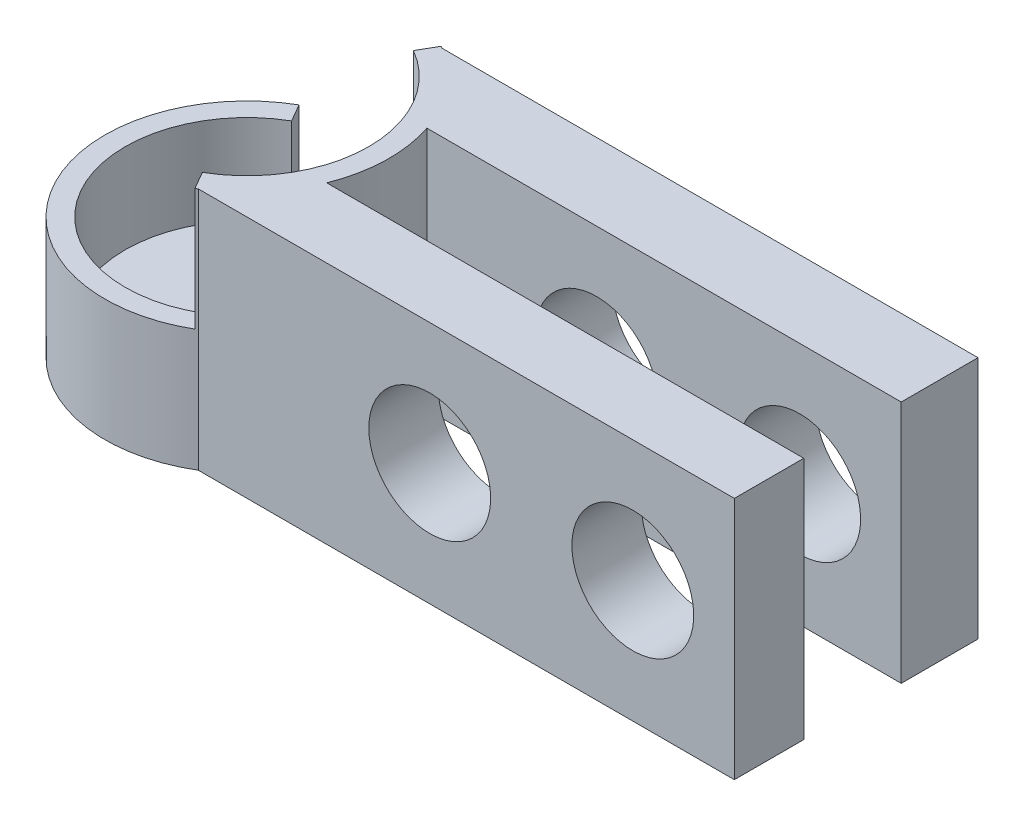
ISO-10303-21;
HEADER;
FILE_DESCRIPTION(('STEP AP214'),'2;1');
FILE_NAME('part.step','',(''),(''),'','','');
FILE_SCHEMA(('AUTOMOTIVE_DESIGN { 1 0 10303 214 1 1 1 1 }'));
ENDSEC;
DATA;
#1=APPLICATION_CONTEXT('core data for automotive mechanical design processes');
#2=APPLICATION_PROTOCOL_DEFINITION('international standard','automotive_design',2000,#1);
#3=PRODUCT_CONTEXT('',#1,'mechanical');
#4=PRODUCT('Part','Part','',(#3));
#5=PRODUCT_RELATED_PRODUCT_CATEGORY('part','',(#4));
#6=PRODUCT_DEFINITION_FORMATION('','',#4);
#7=PRODUCT_DEFINITION_CONTEXT('part definition',#1,'design');
#8=PRODUCT_DEFINITION('design','',#6,#7);
#9=PRODUCT_DEFINITION_SHAPE('','',#8);
#10=(LENGTH_UNIT() NAMED_UNIT(*) SI_UNIT(.MILLI.,.METRE.));
#11=(NAMED_UNIT(*) PLANE_ANGLE_UNIT() SI_UNIT($,.RADIAN.));
#12=(NAMED_UNIT(*) SI_UNIT($,.STERADIAN.) SOLID_ANGLE_UNIT());
#13=UNCERTAINTY_MEASURE_WITH_UNIT(LENGTH_MEASURE(1.E-05),#10,'distance_accuracy_value','');
#14=(GEOMETRIC_REPRESENTATION_CONTEXT(3) GLOBAL_UNCERTAINTY_ASSIGNED_CONTEXT((#13)) GLOBAL_UNIT_ASSIGNED_CONTEXT((#10,
#11,#12)) REPRESENTATION_CONTEXT('',''));
#15=CARTESIAN_POINT('',(0.,0.,0.));
#16=DIRECTION('',(0.,0.,1.));
#17=DIRECTION('',(1.,0.,0.));
#18=AXIS2_PLACEMENT_3D('',#15,#16,#17);
#19=CARTESIAN_POINT('',(-8.75000000000002,34.,-15.1554445662277));
#20=DIRECTION('',(0.866025403784438,0.,-0.500000000000001));
#21=DIRECTION('',(-0.500000000000001,0.,-0.866025403784438));
#22=AXIS2_PLACEMENT_3D('',#19,#20,#21);
#23=PLANE('',#22);
#24=DIRECTION('',(0.,-1.,0.));
#25=VECTOR('',#24,1.);
#26=CARTESIAN_POINT('',(-8.75000000000002,34.,-15.1554445662277));
#27=LINE('',#26,#25);
#28=CARTESIAN_POINT('',(-8.75000000000002,15.,-15.1554445662277));
#29=VERTEX_POINT('',#28);
#30=CARTESIAN_POINT('',(-8.75000000000002,4.,-15.1554445662277));
#31=VERTEX_POINT('',#30);
#32=EDGE_CURVE('E212',#29,#31,#27,.T.);
#33=ORIENTED_EDGE('',*,*,#32,.F.);
#34=DIRECTION('',(0.500000000000001,0.,0.866025403784438));
#35=VECTOR('',#34,1.);
#36=CARTESIAN_POINT('',(-8.75000000000002,15.,-15.1554445662277));
#37=LINE('',#36,#35);
#38=CARTESIAN_POINT('',(-7.50000000000001,15.,-12.9903810567666));
#39=VERTEX_POINT('',#38);
#40=EDGE_CURVE('E149',#29,#39,#37,.T.);
#41=ORIENTED_EDGE('',*,*,#40,.T.);
#42=DIRECTION('',(0.,-1.,0.));
#43=VECTOR('',#42,1.);
#44=CARTESIAN_POINT('',(-7.50000000000001,34.,-12.9903810567666));
#45=LINE('',#44,#43);
#46=CARTESIAN_POINT('',(-7.50000000000001,4.,-12.9903810567666));
#47=VERTEX_POINT('',#46);
#48=EDGE_CURVE('E220',#39,#47,#45,.T.);
#49=ORIENTED_EDGE('',*,*,#48,.T.);
#50=DIRECTION('',(0.500000000000001,0.,0.866025403784438));
#51=VECTOR('',#50,1.);
#52=CARTESIAN_POINT('',(-8.75000000000002,4.,-15.1554445662277));
#53=LINE('',#52,#51);
#54=EDGE_CURVE('E196',#31,#47,#53,.T.);
#55=ORIENTED_EDGE('',*,*,#54,.F.);
#56=EDGE_LOOP('',(#33,#41,#49,#55));
#57=FACE_BOUND('',#56,.T.);
#58=ADVANCED_FACE('F45',(#57),#23,.T.);
#59=CARTESIAN_POINT('',(0.,30.,0.));
#60=DIRECTION('',(0.,-1.,0.));
#61=DIRECTION('',(0.,0.,-1.));
#62=AXIS2_PLACEMENT_3D('',#59,#60,#61);
#63=CYLINDRICAL_SURFACE('',#62,17.5);
#64=CARTESIAN_POINT('',(0.,30.,0.));
#65=DIRECTION('',(0.,1.,0.));
#66=DIRECTION('',(0.,0.,1.));
#67=AXIS2_PLACEMENT_3D('',#64,#65,#66);
#68=CIRCLE('',#67,17.5);
#69=CARTESIAN_POINT('',(8.74999999999997,30.,15.1554445662277));
#70=VERTEX_POINT('',#69);
#71=CARTESIAN_POINT('',(9.01387818865998,30.,15.));
#72=VERTEX_POINT('',#71);
#73=EDGE_CURVE('E167',#70,#72,#68,.T.);
#74=ORIENTED_EDGE('',*,*,#73,.F.);
#75=DIRECTION('',(0.,-1.,0.));
#76=VECTOR('',#75,1.);
#77=CARTESIAN_POINT('',(8.74999999999997,35.,15.1554445662277));
#78=LINE('',#77,#76);
#79=CARTESIAN_POINT('',(8.74999999999997,15.,15.1554445662277));
#80=VERTEX_POINT('',#79);
#81=EDGE_CURVE('E158',#70,#80,#78,.T.);
#82=ORIENTED_EDGE('',*,*,#81,.T.);
#83=CARTESIAN_POINT('',(0.,15.,0.));
#84=DIRECTION('',(0.,1.,0.));
#85=DIRECTION('',(0.,0.,1.));
#86=AXIS2_PLACEMENT_3D('',#83,#84,#85);
#87=CIRCLE('',#86,17.5);
#88=EDGE_CURVE('E146',#29,#80,#87,.T.);
#89=ORIENTED_EDGE('',*,*,#88,.F.);
#90=ORIENTED_EDGE('',*,*,#32,.T.);
#91=CARTESIAN_POINT('',(0.,4.,0.));
#92=DIRECTION('',(0.,1.,0.));
#93=DIRECTION('',(0.,0.,1.));
#94=AXIS2_PLACEMENT_3D('',#91,#92,#93);
#95=CIRCLE('',#94,17.5);
#96=CARTESIAN_POINT('',(8.75000000000002,4.,-15.1554445662277));
#97=VERTEX_POINT('',#96);
#98=EDGE_CURVE('E208',#97,#31,#95,.T.);
#99=ORIENTED_EDGE('',*,*,#98,.F.);
#100=DIRECTION('',(0.,-1.,0.));
#101=VECTOR('',#100,1.);
#102=CARTESIAN_POINT('',(8.75000000000002,34.,-15.1554445662277));
#103=LINE('',#102,#101);
#104=CARTESIAN_POINT('',(8.75000000000002,30.,-15.1554445662277));
#105=VERTEX_POINT('',#104);
#106=EDGE_CURVE('E215',#105,#97,#103,.T.);
#107=ORIENTED_EDGE('',*,*,#106,.F.);
#108=CARTESIAN_POINT('',(9.01387818865998,30.,-15.));
#109=VERTEX_POINT('',#108);
#110=EDGE_CURVE('E238',#109,#105,#68,.T.);
#111=ORIENTED_EDGE('',*,*,#110,.F.);
#112=DIRECTION('',(0.,-1.,0.));
#113=VECTOR('',#112,1.);
#114=CARTESIAN_POINT('',(9.01387818865998,30.,-15.));
#115=LINE('',#114,#113);
#116=CARTESIAN_POINT('',(9.01387818865998,0.,-15.));
#117=VERTEX_POINT('',#116);
#118=EDGE_CURVE('E290',#109,#117,#115,.T.);
#119=ORIENTED_EDGE('',*,*,#118,.T.);
#120=CARTESIAN_POINT('',(0.,0.,0.));
#121=DIRECTION('',(0.,1.,0.));
#122=DIRECTION('',(0.,0.,1.));
#123=AXIS2_PLACEMENT_3D('',#120,#121,#122);
#124=CIRCLE('',#123,17.5);
#125=CARTESIAN_POINT('',(9.01387818865998,0.,15.));
#126=VERTEX_POINT('',#125);
#127=EDGE_CURVE('E264',#117,#126,#124,.T.);
#128=ORIENTED_EDGE('',*,*,#127,.T.);
#129=DIRECTION('',(0.,-1.,0.));
#130=VECTOR('',#129,1.);
#131=CARTESIAN_POINT('',(9.01387818865998,30.,15.));
#132=LINE('',#131,#130);
#133=EDGE_CURVE('E286',#72,#126,#132,.T.);
#134=ORIENTED_EDGE('',*,*,#133,.F.);
#135=EDGE_LOOP('',(#74,#82,#89,#90,#99,#107,#111,#119,#128,#134));
#136=FACE_BOUND('',#135,.T.);
#137=ADVANCED_FACE('F165',(#136),#63,.T.);
#138=CARTESIAN_POINT('',(0.,30.,0.));
#139=DIRECTION('',(0.,1.,0.));
#140=DIRECTION('',(0.,0.,1.));
#141=AXIS2_PLACEMENT_3D('',#138,#139,#140);
#142=PLANE('',#141);
#143=DIRECTION('',(-0.499999999999998,0.,-0.86602540378444));
#144=VECTOR('',#143,1.);
#145=CARTESIAN_POINT('',(0.,30.,0.));
#146=LINE('',#145,#144);
#147=CARTESIAN_POINT('',(7.49999999999997,30.,12.9903810567666));
#148=VERTEX_POINT('',#147);
#149=EDGE_CURVE('E176',#70,#148,#146,.T.);
#150=ORIENTED_EDGE('',*,*,#149,.F.);
#151=ORIENTED_EDGE('',*,*,#73,.T.);
#152=DIRECTION('',(1.,0.,0.));
#153=VECTOR('',#152,1.);
#154=CARTESIAN_POINT('',(9.01387818865998,30.,15.));
#155=LINE('',#154,#153);
#156=CARTESIAN_POINT('',(75.,30.,15.));
#157=VERTEX_POINT('',#156);
#158=EDGE_CURVE('E242',#72,#157,#155,.T.);
#159=ORIENTED_EDGE('',*,*,#158,.T.);
#160=DIRECTION('',(0.,0.,-1.));
#161=VECTOR('',#160,1.);
#162=CARTESIAN_POINT('',(75.,30.,6.45090059910484));
#163=LINE('',#162,#161);
#164=CARTESIAN_POINT('',(75.,30.,6.45090059910484));
#165=VERTEX_POINT('',#164);
#166=EDGE_CURVE('E245',#157,#165,#163,.T.);
#167=ORIENTED_EDGE('',*,*,#166,.T.);
#168=DIRECTION('',(-1.,0.,0.));
#169=VECTOR('',#168,1.);
#170=CARTESIAN_POINT('',(75.,30.,6.45090059910484));
#171=LINE('',#170,#169);
#172=CARTESIAN_POINT('',(16.2676329396894,30.,6.45090059910484));
#173=VERTEX_POINT('',#172);
#174=EDGE_CURVE('E248',#165,#173,#171,.T.);
#175=ORIENTED_EDGE('',*,*,#174,.T.);
#176=CARTESIAN_POINT('',(0.,30.,0.));
#177=DIRECTION('',(0.,1.,0.));
#178=DIRECTION('',(0.,0.,1.));
#179=AXIS2_PLACEMENT_3D('',#176,#177,#178);
#180=CIRCLE('',#179,17.5);
#181=CARTESIAN_POINT('',(16.5969122380937,30.,-5.54909940089516));
#182=VERTEX_POINT('',#181);
#183=EDGE_CURVE('E224',#173,#182,#180,.T.);
#184=ORIENTED_EDGE('',*,*,#183,.T.);
#185=DIRECTION('',(1.,0.,0.));
#186=VECTOR('',#185,1.);
#187=CARTESIAN_POINT('',(75.,30.,-5.54909940089517));
#188=LINE('',#187,#186);
#189=CARTESIAN_POINT('',(75.,30.,-5.54909940089517));
#190=VERTEX_POINT('',#189);
#191=EDGE_CURVE('E228',#182,#190,#188,.T.);
#192=ORIENTED_EDGE('',*,*,#191,.T.);
#193=DIRECTION('',(0.,0.,-1.));
#194=VECTOR('',#193,1.);
#195=CARTESIAN_POINT('',(75.,30.,-15.));
#196=LINE('',#195,#194);
#197=CARTESIAN_POINT('',(75.,30.,-15.));
#198=VERTEX_POINT('',#197);
#199=EDGE_CURVE('E232',#190,#198,#196,.T.);
#200=ORIENTED_EDGE('',*,*,#199,.T.);
#201=DIRECTION('',(-1.,0.,0.));
#202=VECTOR('',#201,1.);
#203=CARTESIAN_POINT('',(9.01387818865998,30.,-15.));
#204=LINE('',#203,#202);
#205=EDGE_CURVE('E235',#198,#109,#204,.T.);
#206=ORIENTED_EDGE('',*,*,#205,.T.);
#207=ORIENTED_EDGE('',*,*,#110,.T.);
#208=DIRECTION('',(0.500000000000001,0.,-0.866025403784438));
#209=VECTOR('',#208,1.);
#210=CARTESIAN_POINT('',(0.,30.,0.));
#211=LINE('',#210,#209);
#212=CARTESIAN_POINT('',(7.50000000000002,30.,-12.9903810567666));
#213=VERTEX_POINT('',#212);
#214=EDGE_CURVE('E306',#213,#105,#211,.T.);
#215=ORIENTED_EDGE('',*,*,#214,.F.);
#216=CARTESIAN_POINT('',(0.,30.,0.));
#217=DIRECTION('',(0.,1.,0.));
#218=DIRECTION('',(0.,0.,1.));
#219=AXIS2_PLACEMENT_3D('',#216,#217,#218);
#220=CIRCLE('',#219,15.);
#221=EDGE_CURVE('E55',#213,#148,#220,.F.);
#222=ORIENTED_EDGE('',*,*,#221,.T.);
#223=EDGE_LOOP('',(#150,#151,#159,#167,#175,#184,#192,#200,#206,#207,#215,#222));
#224=FACE_BOUND('',#223,.T.);
#225=ADVANCED_FACE('F386',(#224),#142,.T.);
#226=CARTESIAN_POINT('',(0.,30.,0.));
#227=DIRECTION('',(0.,-1.,0.));
#228=DIRECTION('',(0.,0.,-1.));
#229=AXIS2_PLACEMENT_3D('',#226,#227,#228);
#230=CYLINDRICAL_SURFACE('',#229,17.5);
#231=CARTESIAN_POINT('',(0.,0.,0.));
#232=DIRECTION('',(0.,1.,0.));
#233=DIRECTION('',(0.,0.,1.));
#234=AXIS2_PLACEMENT_3D('',#231,#232,#233);
#235=CIRCLE('',#234,17.5);
#236=CARTESIAN_POINT('',(16.2676329396894,0.,6.45090059910484));
#237=VERTEX_POINT('',#236);
#238=CARTESIAN_POINT('',(16.5969122380937,0.,-5.54909940089516));
#239=VERTEX_POINT('',#238);
#240=EDGE_CURVE('E223',#237,#239,#235,.T.);
#241=ORIENTED_EDGE('',*,*,#240,.T.);
#242=DIRECTION('',(0.,-1.,0.));
#243=VECTOR('',#242,1.);
#244=CARTESIAN_POINT('',(16.5969122380937,30.,-5.54909940089516));
#245=LINE('',#244,#243);
#246=EDGE_CURVE('E302',#182,#239,#245,.T.);
#247=ORIENTED_EDGE('',*,*,#246,.F.);
#248=ORIENTED_EDGE('',*,*,#183,.F.);
#249=DIRECTION('',(0.,-1.,0.));
#250=VECTOR('',#249,1.);
#251=CARTESIAN_POINT('',(16.2676329396894,30.,6.45090059910484));
#252=LINE('',#251,#250);
#253=EDGE_CURVE('E251',#173,#237,#252,.T.);
#254=ORIENTED_EDGE('',*,*,#253,.T.);
#255=EDGE_LOOP('',(#241,#247,#248,#254));
#256=FACE_BOUND('',#255,.T.);
#257=ADVANCED_FACE('F47',(#256),#230,.T.);
#258=CARTESIAN_POINT('',(75.,30.,-5.54909940089517));
#259=DIRECTION('',(0.,0.,-1.));
#260=DIRECTION('',(-1.,0.,0.));
#261=AXIS2_PLACEMENT_3D('',#258,#259,#260);
#262=PLANE('',#261);
#263=CARTESIAN_POINT('',(62.5,15.,-5.54909940089516));
#264=DIRECTION('',(0.,0.,-1.));
#265=DIRECTION('',(-1.,0.,0.));
#266=AXIS2_PLACEMENT_3D('',#263,#264,#265);
#267=CIRCLE('',#266,7.50000000000001);
#268=CARTESIAN_POINT('',(55.,15.,-5.54909940089516));
#269=VERTEX_POINT('',#268);
#270=EDGE_CURVE('E154',#269,#269,#267,.F.);
#271=ORIENTED_EDGE('',*,*,#270,.F.);
#272=EDGE_LOOP('',(#271));
#273=FACE_BOUND('',#272,.T.);
#274=CARTESIAN_POINT('',(37.5,15.,-5.54909940089516));
#275=DIRECTION('',(0.,0.,-1.));
#276=DIRECTION('',(-1.,0.,0.));
#277=AXIS2_PLACEMENT_3D('',#274,#275,#276);
#278=CIRCLE('',#277,7.5);
#279=CARTESIAN_POINT('',(30.,15.,-5.54909940089516));
#280=VERTEX_POINT('',#279);
#281=EDGE_CURVE('E339',#280,#280,#278,.F.);
#282=ORIENTED_EDGE('',*,*,#281,.F.);
#283=EDGE_LOOP('',(#282));
#284=FACE_BOUND('',#283,.T.);
#285=DIRECTION('',(1.,0.,0.));
#286=VECTOR('',#285,1.);
#287=CARTESIAN_POINT('',(75.,0.,-5.54909940089517));
#288=LINE('',#287,#286);
#289=CARTESIAN_POINT('',(75.,0.,-5.54909940089517));
#290=VERTEX_POINT('',#289);
#291=EDGE_CURVE('E255',#239,#290,#288,.T.);
#292=ORIENTED_EDGE('',*,*,#291,.T.);
#293=DIRECTION('',(0.,-1.,0.));
#294=VECTOR('',#293,1.);
#295=CARTESIAN_POINT('',(75.,30.,-5.54909940089517));
#296=LINE('',#295,#294);
#297=EDGE_CURVE('E298',#190,#290,#296,.T.);
#298=ORIENTED_EDGE('',*,*,#297,.F.);
#299=ORIENTED_EDGE('',*,*,#191,.F.);
#300=ORIENTED_EDGE('',*,*,#246,.T.);
#301=EDGE_LOOP('',(#292,#298,#299,#300));
#302=FACE_BOUND('',#301,.T.);
#303=ADVANCED_FACE('F359',(#273,#284,#302),#262,.F.);
#304=CARTESIAN_POINT('',(75.,30.,-15.));
#305=DIRECTION('',(-1.,0.,0.));
#306=DIRECTION('',(0.,0.,1.));
#307=AXIS2_PLACEMENT_3D('',#304,#305,#306);
#308=PLANE('',#307);
#309=DIRECTION('',(0.,0.,-1.));
#310=VECTOR('',#309,1.);
#311=CARTESIAN_POINT('',(75.,0.,-15.));
#312=LINE('',#311,#310);
#313=CARTESIAN_POINT('',(75.,0.,-15.));
#314=VERTEX_POINT('',#313);
#315=EDGE_CURVE('E258',#290,#314,#312,.T.);
#316=ORIENTED_EDGE('',*,*,#315,.T.);
#317=DIRECTION('',(0.,-1.,0.));
#318=VECTOR('',#317,1.);
#319=CARTESIAN_POINT('',(75.,30.,-15.));
#320=LINE('',#319,#318);
#321=EDGE_CURVE('E294',#198,#314,#320,.T.);
#322=ORIENTED_EDGE('',*,*,#321,.F.);
#323=ORIENTED_EDGE('',*,*,#199,.F.);
#324=ORIENTED_EDGE('',*,*,#297,.T.);
#325=EDGE_LOOP('',(#316,#322,#323,#324));
#326=FACE_BOUND('',#325,.T.);
#327=ADVANCED_FACE('F362',(#326),#308,.F.);
#328=CARTESIAN_POINT('',(9.01387818865998,30.,-15.));
#329=DIRECTION('',(0.,0.,1.));
#330=DIRECTION('',(1.,0.,0.));
#331=AXIS2_PLACEMENT_3D('',#328,#329,#330);
#332=PLANE('',#331);
#333=CARTESIAN_POINT('',(62.5,15.,-15.));
#334=DIRECTION('',(0.,0.,1.));
#335=DIRECTION('',(1.,0.,0.));
#336=AXIS2_PLACEMENT_3D('',#333,#334,#335);
#337=CIRCLE('',#336,7.50000000000001);
#338=CARTESIAN_POINT('',(70.,15.,-15.));
#339=VERTEX_POINT('',#338);
#340=EDGE_CURVE('E349',#339,#339,#337,.F.);
#341=ORIENTED_EDGE('',*,*,#340,.F.);
#342=EDGE_LOOP('',(#341));
#343=FACE_BOUND('',#342,.T.);
#344=CARTESIAN_POINT('',(37.5,15.,-15.));
#345=DIRECTION('',(0.,0.,1.));
#346=DIRECTION('',(1.,0.,0.));
#347=AXIS2_PLACEMENT_3D('',#344,#345,#346);
#348=CIRCLE('',#347,7.5);
#349=CARTESIAN_POINT('',(45.,15.,-15.));
#350=VERTEX_POINT('',#349);
#351=EDGE_CURVE('E333',#350,#350,#348,.F.);
#352=ORIENTED_EDGE('',*,*,#351,.F.);
#353=EDGE_LOOP('',(#352));
#354=FACE_BOUND('',#353,.T.);
#355=DIRECTION('',(-1.,0.,0.));
#356=VECTOR('',#355,1.);
#357=CARTESIAN_POINT('',(9.01387818865998,0.,-15.));
#358=LINE('',#357,#356);
#359=EDGE_CURVE('E261',#314,#117,#358,.T.);
#360=ORIENTED_EDGE('',*,*,#359,.T.);
#361=ORIENTED_EDGE('',*,*,#118,.F.);
#362=ORIENTED_EDGE('',*,*,#205,.F.);
#363=ORIENTED_EDGE('',*,*,#321,.T.);
#364=EDGE_LOOP('',(#360,#361,#362,#363));
#365=FACE_BOUND('',#364,.T.);
#366=ADVANCED_FACE('F379',(#343,#354,#365),#332,.F.);
#367=CARTESIAN_POINT('',(9.01387818865998,30.,15.));
#368=DIRECTION('',(0.,0.,-1.));
#369=DIRECTION('',(-1.,0.,0.));
#370=AXIS2_PLACEMENT_3D('',#367,#368,#369);
#371=PLANE('',#370);
#372=CARTESIAN_POINT('',(62.5,15.,15.));
#373=DIRECTION('',(0.,0.,-1.));
#374=DIRECTION('',(-1.,0.,0.));
#375=AXIS2_PLACEMENT_3D('',#372,#373,#374);
#376=CIRCLE('',#375,7.50000000000001);
#377=CARTESIAN_POINT('',(55.,15.,15.));
#378=VERTEX_POINT('',#377);
#379=EDGE_CURVE('E345',#378,#378,#376,.F.);
#380=ORIENTED_EDGE('',*,*,#379,.F.);
#381=EDGE_LOOP('',(#380));
#382=FACE_BOUND('',#381,.T.);
#383=CARTESIAN_POINT('',(37.5,15.,15.));
#384=DIRECTION('',(0.,0.,-1.));
#385=DIRECTION('',(-1.,0.,0.));
#386=AXIS2_PLACEMENT_3D('',#383,#384,#385);
#387=CIRCLE('',#386,7.5);
#388=CARTESIAN_POINT('',(30.,15.,15.));
#389=VERTEX_POINT('',#388);
#390=EDGE_CURVE('E328',#389,#389,#387,.F.);
#391=ORIENTED_EDGE('',*,*,#390,.F.);
#392=EDGE_LOOP('',(#391));
#393=FACE_BOUND('',#392,.T.);
#394=DIRECTION('',(1.,0.,0.));
#395=VECTOR('',#394,1.);
#396=CARTESIAN_POINT('',(9.01387818865998,0.,15.));
#397=LINE('',#396,#395);
#398=CARTESIAN_POINT('',(75.,0.,15.));
#399=VERTEX_POINT('',#398);
#400=EDGE_CURVE('E267',#126,#399,#397,.T.);
#401=ORIENTED_EDGE('',*,*,#400,.T.);
#402=DIRECTION('',(0.,-1.,0.));
#403=VECTOR('',#402,1.);
#404=CARTESIAN_POINT('',(75.,30.,15.));
#405=LINE('',#404,#403);
#406=EDGE_CURVE('E282',#157,#399,#405,.T.);
#407=ORIENTED_EDGE('',*,*,#406,.F.);
#408=ORIENTED_EDGE('',*,*,#158,.F.);
#409=ORIENTED_EDGE('',*,*,#133,.T.);
#410=EDGE_LOOP('',(#401,#407,#408,#409));
#411=FACE_BOUND('',#410,.T.);
#412=ADVANCED_FACE('F402',(#382,#393,#411),#371,.F.);
#413=CARTESIAN_POINT('',(75.,30.,6.45090059910484));
#414=DIRECTION('',(-1.,0.,0.));
#415=DIRECTION('',(0.,0.,1.));
#416=AXIS2_PLACEMENT_3D('',#413,#414,#415);
#417=PLANE('',#416);
#418=DIRECTION('',(0.,0.,-1.));
#419=VECTOR('',#418,1.);
#420=CARTESIAN_POINT('',(75.,0.,6.45090059910484));
#421=LINE('',#420,#419);
#422=CARTESIAN_POINT('',(75.,0.,6.45090059910484));
#423=VERTEX_POINT('',#422);
#424=EDGE_CURVE('E270',#399,#423,#421,.T.);
#425=ORIENTED_EDGE('',*,*,#424,.T.);
#426=DIRECTION('',(0.,-1.,0.));
#427=VECTOR('',#426,1.);
#428=CARTESIAN_POINT('',(75.,30.,6.45090059910484));
#429=LINE('',#428,#427);
#430=EDGE_CURVE('E278',#165,#423,#429,.T.);
#431=ORIENTED_EDGE('',*,*,#430,.F.);
#432=ORIENTED_EDGE('',*,*,#166,.F.);
#433=ORIENTED_EDGE('',*,*,#406,.T.);
#434=EDGE_LOOP('',(#425,#431,#432,#433));
#435=FACE_BOUND('',#434,.T.);
#436=ADVANCED_FACE('F398',(#435),#417,.F.);
#437=CARTESIAN_POINT('',(75.,30.,6.45090059910484));
#438=DIRECTION('',(0.,0.,1.));
#439=DIRECTION('',(1.,0.,0.));
#440=AXIS2_PLACEMENT_3D('',#437,#438,#439);
#441=PLANE('',#440);
#442=CARTESIAN_POINT('',(62.5,15.,6.45090059910484));
#443=DIRECTION('',(0.,0.,1.));
#444=DIRECTION('',(1.,0.,0.));
#445=AXIS2_PLACEMENT_3D('',#442,#443,#444);
#446=CIRCLE('',#445,7.50000000000001);
#447=CARTESIAN_POINT('',(70.,15.,6.45090059910484));
#448=VERTEX_POINT('',#447);
#449=EDGE_CURVE('E49',#448,#448,#446,.F.);
#450=ORIENTED_EDGE('',*,*,#449,.F.);
#451=EDGE_LOOP('',(#450));
#452=FACE_BOUND('',#451,.T.);
#453=CARTESIAN_POINT('',(37.5,15.,6.45090059910484));
#454=DIRECTION('',(0.,0.,1.));
#455=DIRECTION('',(1.,0.,0.));
#456=AXIS2_PLACEMENT_3D('',#453,#454,#455);
#457=CIRCLE('',#456,7.5);
#458=CARTESIAN_POINT('',(45.,15.,6.45090059910484));
#459=VERTEX_POINT('',#458);
#460=EDGE_CURVE('E325',#459,#459,#457,.F.);
#461=ORIENTED_EDGE('',*,*,#460,.F.);
#462=EDGE_LOOP('',(#461));
#463=FACE_BOUND('',#462,.T.);
#464=DIRECTION('',(-1.,0.,0.));
#465=VECTOR('',#464,1.);
#466=CARTESIAN_POINT('',(75.,0.,6.45090059910484));
#467=LINE('',#466,#465);
#468=EDGE_CURVE('E229',#423,#237,#467,.T.);
#469=ORIENTED_EDGE('',*,*,#468,.T.);
#470=ORIENTED_EDGE('',*,*,#253,.F.);
#471=ORIENTED_EDGE('',*,*,#174,.F.);
#472=ORIENTED_EDGE('',*,*,#430,.T.);
#473=EDGE_LOOP('',(#469,#470,#471,#472));
#474=FACE_BOUND('',#473,.T.);
#475=ADVANCED_FACE('F394',(#452,#463,#474),#441,.F.);
#476=CARTESIAN_POINT('',(0.,0.,0.));
#477=DIRECTION('',(0.,1.,0.));
#478=DIRECTION('',(0.,0.,1.));
#479=AXIS2_PLACEMENT_3D('',#476,#477,#478);
#480=PLANE('',#479);
#481=CARTESIAN_POINT('',(-6.71751442127213,0.,-6.71751442127227));
#482=DIRECTION('',(0.,1.,0.));
#483=DIRECTION('',(0.,0.,1.));
#484=AXIS2_PLACEMENT_3D('',#481,#482,#483);
#485=CIRCLE('',#484,2.);
#486=CARTESIAN_POINT('',(-6.71751442127213,0.,-4.71751442127227));
#487=VERTEX_POINT('',#486);
#488=EDGE_CURVE('E184',#487,#487,#485,.T.);
#489=ORIENTED_EDGE('',*,*,#488,.T.);
#490=EDGE_LOOP('',(#489));
#491=FACE_BOUND('',#490,.T.);
#492=CARTESIAN_POINT('',(6.71751442127218,0.,6.71751442127222));
#493=DIRECTION('',(0.,1.,0.));
#494=DIRECTION('',(0.,0.,1.));
#495=AXIS2_PLACEMENT_3D('',#492,#493,#494);
#496=CIRCLE('',#495,2.);
#497=CARTESIAN_POINT('',(6.71751442127218,0.,8.71751442127222));
#498=VERTEX_POINT('',#497);
#499=EDGE_CURVE('E183',#498,#498,#496,.T.);
#500=ORIENTED_EDGE('',*,*,#499,.T.);
#501=EDGE_LOOP('',(#500));
#502=FACE_BOUND('',#501,.T.);
#503=CARTESIAN_POINT('',(6.7175144212722,0.,-6.7175144212722));
#504=DIRECTION('',(0.,1.,0.));
#505=DIRECTION('',(0.,0.,1.));
#506=AXIS2_PLACEMENT_3D('',#503,#504,#505);
#507=CIRCLE('',#506,2.);
#508=CARTESIAN_POINT('',(6.7175144212722,0.,-4.7175144212722));
#509=VERTEX_POINT('',#508);
#510=EDGE_CURVE('E179',#509,#509,#507,.T.);
#511=ORIENTED_EDGE('',*,*,#510,.T.);
#512=EDGE_LOOP('',(#511));
#513=FACE_BOUND('',#512,.T.);
#514=CARTESIAN_POINT('',(-6.71751442127225,0.,6.71751442127215));
#515=DIRECTION('',(0.,1.,0.));
#516=DIRECTION('',(0.,0.,1.));
#517=AXIS2_PLACEMENT_3D('',#514,#515,#516);
#518=CIRCLE('',#517,2.);
#519=CARTESIAN_POINT('',(-6.71751442127225,0.,8.71751442127215));
#520=VERTEX_POINT('',#519);
#521=EDGE_CURVE('E188',#520,#520,#518,.T.);
#522=ORIENTED_EDGE('',*,*,#521,.T.);
#523=EDGE_LOOP('',(#522));
#524=FACE_BOUND('',#523,.T.);
#525=ORIENTED_EDGE('',*,*,#240,.F.);
#526=ORIENTED_EDGE('',*,*,#468,.F.);
#527=ORIENTED_EDGE('',*,*,#424,.F.);
#528=ORIENTED_EDGE('',*,*,#400,.F.);
#529=ORIENTED_EDGE('',*,*,#127,.F.);
#530=ORIENTED_EDGE('',*,*,#359,.F.);
#531=ORIENTED_EDGE('',*,*,#315,.F.);
#532=ORIENTED_EDGE('',*,*,#291,.F.);
#533=EDGE_LOOP('',(#525,#526,#527,#528,#529,#530,#531,#532));
#534=FACE_BOUND('',#533,.T.);
#535=ADVANCED_FACE('F374',(#491,#502,#513,#524,#534),#480,.F.);
#536=CARTESIAN_POINT('',(0.,34.,0.));
#537=DIRECTION('',(0.,-1.,0.));
#538=DIRECTION('',(0.,0.,-1.));
#539=AXIS2_PLACEMENT_3D('',#536,#537,#538);
#540=CYLINDRICAL_SURFACE('',#539,15.);
#541=DIRECTION('',(0.,-1.,0.));
#542=VECTOR('',#541,1.);
#543=CARTESIAN_POINT('',(7.49999999999997,34.,12.9903810567666));
#544=LINE('',#543,#542);
#545=CARTESIAN_POINT('',(7.49999999999997,15.,12.9903810567666));
#546=VERTEX_POINT('',#545);
#547=EDGE_CURVE('E11',#148,#546,#544,.T.);
#548=ORIENTED_EDGE('',*,*,#547,.F.);
#549=ORIENTED_EDGE('',*,*,#221,.F.);
#550=DIRECTION('',(0.,-1.,0.));
#551=VECTOR('',#550,1.);
#552=CARTESIAN_POINT('',(7.50000000000002,34.,-12.9903810567666));
#553=LINE('',#552,#551);
#554=CARTESIAN_POINT('',(7.50000000000002,4.,-12.9903810567666));
#555=VERTEX_POINT('',#554);
#556=EDGE_CURVE('E70',#213,#555,#553,.T.);
#557=ORIENTED_EDGE('',*,*,#556,.T.);
#558=CARTESIAN_POINT('',(0.,4.,0.));
#559=DIRECTION('',(0.,1.,0.));
#560=DIRECTION('',(0.,0.,1.));
#561=AXIS2_PLACEMENT_3D('',#558,#559,#560);
#562=CIRCLE('',#561,15.);
#563=EDGE_CURVE('E200',#47,#555,#562,.T.);
#564=ORIENTED_EDGE('',*,*,#563,.F.);
#565=ORIENTED_EDGE('',*,*,#48,.F.);
#566=CARTESIAN_POINT('',(0.,15.,0.));
#567=DIRECTION('',(0.,1.,0.));
#568=DIRECTION('',(0.,0.,1.));
#569=AXIS2_PLACEMENT_3D('',#566,#567,#568);
#570=CIRCLE('',#569,15.);
#571=EDGE_CURVE('E169',#39,#546,#570,.T.);
#572=ORIENTED_EDGE('',*,*,#571,.T.);
#573=EDGE_LOOP('',(#548,#549,#557,#564,#565,#572));
#574=FACE_BOUND('',#573,.T.);
#575=ADVANCED_FACE('F405',(#574),#540,.F.);
#576=CARTESIAN_POINT('',(8.75000000000002,34.,-15.1554445662277));
#577=DIRECTION('',(0.866025403784438,0.,0.500000000000001));
#578=DIRECTION('',(0.500000000000001,0.,-0.866025403784438));
#579=AXIS2_PLACEMENT_3D('',#576,#577,#578);
#580=PLANE('',#579);
#581=ORIENTED_EDGE('',*,*,#106,.T.);
#582=DIRECTION('',(-0.500000000000001,0.,0.866025403784438));
#583=VECTOR('',#582,1.);
#584=CARTESIAN_POINT('',(8.75000000000002,4.,-15.1554445662277));
#585=LINE('',#584,#583);
#586=EDGE_CURVE('E205',#97,#555,#585,.T.);
#587=ORIENTED_EDGE('',*,*,#586,.T.);
#588=ORIENTED_EDGE('',*,*,#556,.F.);
#589=ORIENTED_EDGE('',*,*,#214,.T.);
#590=EDGE_LOOP('',(#581,#587,#588,#589));
#591=FACE_BOUND('',#590,.T.);
#592=ADVANCED_FACE('F413',(#591),#580,.F.);
#593=CARTESIAN_POINT('',(0.,4.,0.));
#594=DIRECTION('',(0.,1.,0.));
#595=DIRECTION('',(0.,0.,1.));
#596=AXIS2_PLACEMENT_3D('',#593,#594,#595);
#597=PLANE('',#596);
#598=CARTESIAN_POINT('',(-6.71751442127213,4.,-6.71751442127227));
#599=DIRECTION('',(0.,1.,0.));
#600=DIRECTION('',(0.,0.,1.));
#601=AXIS2_PLACEMENT_3D('',#598,#599,#600);
#602=CIRCLE('',#601,2.);
#603=CARTESIAN_POINT('',(-6.71751442127213,4.,-4.71751442127227));
#604=VERTEX_POINT('',#603);
#605=EDGE_CURVE('E201',#604,#604,#602,.F.);
#606=ORIENTED_EDGE('',*,*,#605,.T.);
#607=EDGE_LOOP('',(#606));
#608=FACE_BOUND('',#607,.T.);
#609=CARTESIAN_POINT('',(6.71751442127218,4.,6.71751442127222));
#610=DIRECTION('',(0.,1.,0.));
#611=DIRECTION('',(0.,0.,1.));
#612=AXIS2_PLACEMENT_3D('',#609,#610,#611);
#613=CIRCLE('',#612,2.);
#614=CARTESIAN_POINT('',(6.71751442127218,4.,8.71751442127222));
#615=VERTEX_POINT('',#614);
#616=EDGE_CURVE('E319',#615,#615,#613,.F.);
#617=ORIENTED_EDGE('',*,*,#616,.T.);
#618=EDGE_LOOP('',(#617));
#619=FACE_BOUND('',#618,.T.);
#620=CARTESIAN_POINT('',(6.7175144212722,4.,-6.7175144212722));
#621=DIRECTION('',(0.,1.,0.));
#622=DIRECTION('',(0.,0.,1.));
#623=AXIS2_PLACEMENT_3D('',#620,#621,#622);
#624=CIRCLE('',#623,2.);
#625=CARTESIAN_POINT('',(6.7175144212722,4.,-4.7175144212722));
#626=VERTEX_POINT('',#625);
#627=EDGE_CURVE('E315',#626,#626,#624,.F.);
#628=ORIENTED_EDGE('',*,*,#627,.T.);
#629=EDGE_LOOP('',(#628));
#630=FACE_BOUND('',#629,.T.);
#631=CARTESIAN_POINT('',(-6.71751442127225,4.,6.71751442127215));
#632=DIRECTION('',(0.,1.,0.));
#633=DIRECTION('',(0.,0.,1.));
#634=AXIS2_PLACEMENT_3D('',#631,#632,#633);
#635=CIRCLE('',#634,2.);
#636=CARTESIAN_POINT('',(-6.71751442127225,4.,8.71751442127215));
#637=VERTEX_POINT('',#636);
#638=EDGE_CURVE('E195',#637,#637,#635,.F.);
#639=ORIENTED_EDGE('',*,*,#638,.T.);
#640=EDGE_LOOP('',(#639));
#641=FACE_BOUND('',#640,.T.);
#642=ORIENTED_EDGE('',*,*,#54,.T.);
#643=ORIENTED_EDGE('',*,*,#563,.T.);
#644=ORIENTED_EDGE('',*,*,#586,.F.);
#645=ORIENTED_EDGE('',*,*,#98,.T.);
#646=EDGE_LOOP('',(#642,#643,#644,#645));
#647=FACE_BOUND('',#646,.T.);
#648=ADVANCED_FACE('F412',(#608,#619,#630,#641,#647),#597,.T.);
#649=CARTESIAN_POINT('',(-6.71751442127225,9.5,6.71751442127215));
#650=DIRECTION('',(0.,-1.,0.));
#651=DIRECTION('',(0.,0.,-1.));
#652=AXIS2_PLACEMENT_3D('',#649,#650,#651);
#653=CYLINDRICAL_SURFACE('',#652,2.);
#654=ORIENTED_EDGE('',*,*,#638,.F.);
#655=EDGE_LOOP('',(#654));
#656=FACE_BOUND('',#655,.T.);
#657=ORIENTED_EDGE('',*,*,#521,.F.);
#658=EDGE_LOOP('',(#657));
#659=FACE_BOUND('',#658,.T.);
#660=ADVANCED_FACE('F421',(#656,#659),#653,.F.);
#661=CARTESIAN_POINT('',(6.7175144212722,9.5,-6.7175144212722));
#662=DIRECTION('',(0.,-1.,0.));
#663=DIRECTION('',(0.,0.,-1.));
#664=AXIS2_PLACEMENT_3D('',#661,#662,#663);
#665=CYLINDRICAL_SURFACE('',#664,2.);
#666=ORIENTED_EDGE('',*,*,#627,.F.);
#667=EDGE_LOOP('',(#666));
#668=FACE_BOUND('',#667,.T.);
#669=ORIENTED_EDGE('',*,*,#510,.F.);
#670=EDGE_LOOP('',(#669));
#671=FACE_BOUND('',#670,.T.);
#672=ADVANCED_FACE('F482',(#668,#671),#665,.F.);
#673=CARTESIAN_POINT('',(6.71751442127218,9.5,6.71751442127222));
#674=DIRECTION('',(0.,-1.,0.));
#675=DIRECTION('',(0.,0.,-1.));
#676=AXIS2_PLACEMENT_3D('',#673,#674,#675);
#677=CYLINDRICAL_SURFACE('',#676,2.);
#678=ORIENTED_EDGE('',*,*,#616,.F.);
#679=EDGE_LOOP('',(#678));
#680=FACE_BOUND('',#679,.T.);
#681=ORIENTED_EDGE('',*,*,#499,.F.);
#682=EDGE_LOOP('',(#681));
#683=FACE_BOUND('',#682,.T.);
#684=ADVANCED_FACE('F491',(#680,#683),#677,.F.);
#685=CARTESIAN_POINT('',(-6.71751442127213,9.5,-6.71751442127227));
#686=DIRECTION('',(0.,-1.,0.));
#687=DIRECTION('',(0.,0.,-1.));
#688=AXIS2_PLACEMENT_3D('',#685,#686,#687);
#689=CYLINDRICAL_SURFACE('',#688,2.);
#690=ORIENTED_EDGE('',*,*,#605,.F.);
#691=EDGE_LOOP('',(#690));
#692=FACE_BOUND('',#691,.T.);
#693=ORIENTED_EDGE('',*,*,#488,.F.);
#694=EDGE_LOOP('',(#693));
#695=FACE_BOUND('',#694,.T.);
#696=ADVANCED_FACE('F499',(#692,#695),#689,.F.);
#697=CARTESIAN_POINT('',(0.,35.,0.));
#698=DIRECTION('',(0.86602540378444,0.,-0.499999999999998));
#699=DIRECTION('',(-0.499999999999998,0.,-0.86602540378444));
#700=AXIS2_PLACEMENT_3D('',#697,#698,#699);
#701=PLANE('',#700);
#702=ORIENTED_EDGE('',*,*,#149,.T.);
#703=ORIENTED_EDGE('',*,*,#547,.T.);
#704=DIRECTION('',(0.499999999999998,0.,0.86602540378444));
#705=VECTOR('',#704,1.);
#706=CARTESIAN_POINT('',(0.,15.,0.));
#707=LINE('',#706,#705);
#708=EDGE_CURVE('E63',#546,#80,#707,.T.);
#709=ORIENTED_EDGE('',*,*,#708,.T.);
#710=ORIENTED_EDGE('',*,*,#81,.F.);
#711=EDGE_LOOP('',(#702,#703,#709,#710));
#712=FACE_BOUND('',#711,.T.);
#713=ADVANCED_FACE('F157',(#712),#701,.F.);
#714=CARTESIAN_POINT('',(0.,15.,0.));
#715=DIRECTION('',(0.,1.,0.));
#716=DIRECTION('',(0.,0.,1.));
#717=AXIS2_PLACEMENT_3D('',#714,#715,#716);
#718=PLANE('',#717);
#719=ORIENTED_EDGE('',*,*,#88,.T.);
#720=ORIENTED_EDGE('',*,*,#708,.F.);
#721=ORIENTED_EDGE('',*,*,#571,.F.);
#722=ORIENTED_EDGE('',*,*,#40,.F.);
#723=EDGE_LOOP('',(#719,#720,#721,#722));
#724=FACE_BOUND('',#723,.T.);
#725=ADVANCED_FACE('F147',(#724),#718,.T.);
#726=CARTESIAN_POINT('',(37.5,15.,20.));
#727=DIRECTION('',(0.,0.,-1.));
#728=DIRECTION('',(-1.,0.,0.));
#729=AXIS2_PLACEMENT_3D('',#726,#727,#728);
#730=CYLINDRICAL_SURFACE('',#729,7.5);
#731=ORIENTED_EDGE('',*,*,#460,.T.);
#732=EDGE_LOOP('',(#731));
#733=FACE_BOUND('',#732,.T.);
#734=ORIENTED_EDGE('',*,*,#390,.T.);
#735=EDGE_LOOP('',(#734));
#736=FACE_BOUND('',#735,.T.);
#737=ADVANCED_FACE('F530',(#733,#736),#730,.F.);
#738=CARTESIAN_POINT('',(62.5,15.,20.));
#739=DIRECTION('',(0.,0.,-1.));
#740=DIRECTION('',(-1.,0.,0.));
#741=AXIS2_PLACEMENT_3D('',#738,#739,#740);
#742=CYLINDRICAL_SURFACE('',#741,7.50000000000001);
#743=ORIENTED_EDGE('',*,*,#449,.T.);
#744=EDGE_LOOP('',(#743));
#745=FACE_BOUND('',#744,.T.);
#746=ORIENTED_EDGE('',*,*,#379,.T.);
#747=EDGE_LOOP('',(#746));
#748=FACE_BOUND('',#747,.T.);
#749=ADVANCED_FACE('F539',(#745,#748),#742,.F.);
#750=ORIENTED_EDGE('',*,*,#351,.T.);
#751=EDGE_LOOP('',(#750));
#752=FACE_BOUND('',#751,.T.);
#753=ORIENTED_EDGE('',*,*,#281,.T.);
#754=EDGE_LOOP('',(#753));
#755=FACE_BOUND('',#754,.T.);
#756=ADVANCED_FACE('F541',(#752,#755),#730,.F.);
#757=ORIENTED_EDGE('',*,*,#340,.T.);
#758=EDGE_LOOP('',(#757));
#759=FACE_BOUND('',#758,.T.);
#760=ORIENTED_EDGE('',*,*,#270,.T.);
#761=EDGE_LOOP('',(#760));
#762=FACE_BOUND('',#761,.T.);
#763=ADVANCED_FACE('F357',(#759,#762),#742,.F.);
#764=CLOSED_SHELL('',(#58,#137,#225,#257,#303,#327,#366,#412,#436,#475,#535,#575,#592,#648,#660,
#672,#684,#696,#713,#725,#737,#749,#756,#763));
#765=MANIFOLD_SOLID_BREP('B2',#764);
#766=ADVANCED_BREP_SHAPE_REPRESENTATION('',(#18,#765),#14);
#767=SHAPE_DEFINITION_REPRESENTATION(#9,#766);
ENDSEC;
END-ISO-10303-21;
